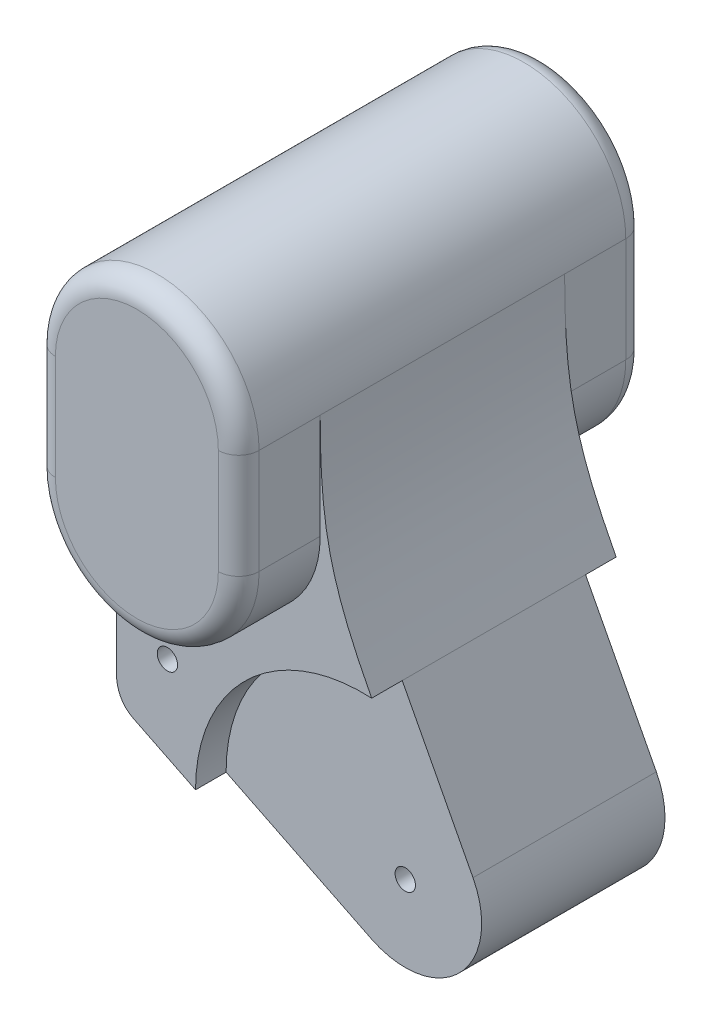
ISO-10303-21;
HEADER;
FILE_DESCRIPTION(('STEP AP214'),'2;1');
FILE_NAME('part.step','',(''),(''),'','','');
FILE_SCHEMA(('AUTOMOTIVE_DESIGN { 1 0 10303 214 1 1 1 1 }'));
ENDSEC;
DATA;
#1=APPLICATION_CONTEXT('core data for automotive mechanical design processes');
#2=APPLICATION_PROTOCOL_DEFINITION('international standard','automotive_design',2000,#1);
#3=PRODUCT_CONTEXT('',#1,'mechanical');
#4=PRODUCT('Part','Part','',(#3));
#5=PRODUCT_RELATED_PRODUCT_CATEGORY('part','',(#4));
#6=PRODUCT_DEFINITION_FORMATION('','',#4);
#7=PRODUCT_DEFINITION_CONTEXT('part definition',#1,'design');
#8=PRODUCT_DEFINITION('design','',#6,#7);
#9=PRODUCT_DEFINITION_SHAPE('','',#8);
#10=(LENGTH_UNIT() NAMED_UNIT(*) SI_UNIT(.MILLI.,.METRE.));
#11=(NAMED_UNIT(*) PLANE_ANGLE_UNIT() SI_UNIT($,.RADIAN.));
#12=(NAMED_UNIT(*) SI_UNIT($,.STERADIAN.) SOLID_ANGLE_UNIT());
#13=UNCERTAINTY_MEASURE_WITH_UNIT(LENGTH_MEASURE(1.E-05),#10,'distance_accuracy_value','');
#14=(GEOMETRIC_REPRESENTATION_CONTEXT(3) GLOBAL_UNCERTAINTY_ASSIGNED_CONTEXT((#13)) GLOBAL_UNIT_ASSIGNED_CONTEXT((#10,
#11,#12)) REPRESENTATION_CONTEXT('',''));
#15=CARTESIAN_POINT('',(0.,0.,0.));
#16=DIRECTION('',(0.,0.,1.));
#17=DIRECTION('',(1.,0.,0.));
#18=AXIS2_PLACEMENT_3D('',#15,#16,#17);
#19=CARTESIAN_POINT('',(10.4935176494257,10.3242980579361,0.));
#20=DIRECTION('',(0.,0.,-1.));
#21=DIRECTION('',(-1.,0.,0.));
#22=AXIS2_PLACEMENT_3D('',#19,#20,#21);
#23=PLANE('',#22);
#24=DIRECTION('',(0.,-1.,0.));
#25=VECTOR('',#24,1.);
#26=CARTESIAN_POINT('',(10.,10.3242980579361,0.));
#27=LINE('',#26,#25);
#28=CARTESIAN_POINT('',(10.,16.,0.));
#29=VERTEX_POINT('',#28);
#30=CARTESIAN_POINT('',(10.,10.8509069292975,0.));
#31=VERTEX_POINT('',#30);
#32=EDGE_CURVE('E208',#29,#31,#27,.T.);
#33=ORIENTED_EDGE('',*,*,#32,.F.);
#34=CARTESIAN_POINT('',(12.5270912932566,5.23059027215242,0.));
#35=CARTESIAN_POINT('',(10.4736833007163,9.15894696582903,0.));
#36=CARTESIAN_POINT('',(10.,11.2956510979498,0.));
#37=CARTESIAN_POINT('',(10.,16.,0.));
#38=B_SPLINE_CURVE_WITH_KNOTS('',3,(#34,#35,#36,#37),.UNSPECIFIED.,.F.,.F.,(4,4),(0.,1.),.UNSPECIFIED.);
#39=CARTESIAN_POINT('',(12.5270912932566,5.23059027215242,0.));
#40=VERTEX_POINT('',#39);
#41=EDGE_CURVE('E243',#40,#29,#38,.T.);
#42=ORIENTED_EDGE('',*,*,#41,.F.);
#43=CARTESIAN_POINT('',(12.1031617842985,-2.98102120584777,0.));
#44=DIRECTION('',(0.,0.,1.));
#45=DIRECTION('',(1.,0.,0.));
#46=AXIS2_PLACEMENT_3D('',#43,#44,#45);
#47=CIRCLE('',#46,8.22254700772151);
#48=CARTESIAN_POINT('',(3.8806186286962,-2.98898037969,0.));
#49=VERTEX_POINT('',#48);
#50=EDGE_CURVE('E211',#40,#49,#47,.T.);
#51=ORIENTED_EDGE('',*,*,#50,.T.);
#52=DIRECTION('',(0.896619982959267,-0.44280086512802,0.));
#53=VECTOR('',#52,1.);
#54=CARTESIAN_POINT('',(0.839496755769924,-1.48710509039849,0.));
#55=LINE('',#54,#53);
#56=CARTESIAN_POINT('',(0.839496755769925,-1.48710509039849,0.));
#57=VERTEX_POINT('',#56);
#58=EDGE_CURVE('E250',#57,#49,#55,.T.);
#59=ORIENTED_EDGE('',*,*,#58,.F.);
#60=CARTESIAN_POINT('',(0.,0.,0.));
#61=CARTESIAN_POINT('',(0.,-0.54020276968755,0.));
#62=CARTESIAN_POINT('',(0.191605084007119,-1.16714011279566,0.));
#63=CARTESIAN_POINT('',(0.839496755769925,-1.48710509039849,0.));
#64=B_SPLINE_CURVE_WITH_KNOTS('',3,(#60,#61,#62,#63),.UNSPECIFIED.,.F.,.F.,(4,4),(0.,1.),.UNSPECIFIED.);
#65=CARTESIAN_POINT('',(0.,0.,0.));
#66=VERTEX_POINT('',#65);
#67=EDGE_CURVE('E342',#66,#57,#64,.T.);
#68=ORIENTED_EDGE('',*,*,#67,.F.);
#69=DIRECTION('',(0.,-1.,0.));
#70=VECTOR('',#69,1.);
#71=CARTESIAN_POINT('',(0.,16.,0.));
#72=LINE('',#71,#70);
#73=CARTESIAN_POINT('',(0.,10.8509069292975,0.));
#74=VERTEX_POINT('',#73);
#75=EDGE_CURVE('E337',#74,#66,#72,.T.);
#76=ORIENTED_EDGE('',*,*,#75,.F.);
#77=CARTESIAN_POINT('',(5.,10.8509069292975,0.));
#78=DIRECTION('',(0.,0.,-1.));
#79=DIRECTION('',(-1.,0.,0.));
#80=AXIS2_PLACEMENT_3D('',#77,#78,#79);
#81=CIRCLE('',#80,5.);
#82=EDGE_CURVE('E188',#31,#74,#81,.T.);
#83=ORIENTED_EDGE('',*,*,#82,.F.);
#84=EDGE_LOOP('',(#33,#42,#51,#59,#68,#76,#83));
#85=FACE_BOUND('',#84,.T.);
#86=CARTESIAN_POINT('',(2.5,1.87521984569876,0.));
#87=DIRECTION('',(0.,0.,1.));
#88=DIRECTION('',(1.,0.,0.));
#89=AXIS2_PLACEMENT_3D('',#86,#87,#88);
#90=CIRCLE('',#89,0.500000000000002);
#91=CARTESIAN_POINT('',(3.,1.87521984569876,0.));
#92=VERTEX_POINT('',#91);
#93=EDGE_CURVE('E244',#92,#92,#90,.T.);
#94=ORIENTED_EDGE('',*,*,#93,.T.);
#95=EDGE_LOOP('',(#94));
#96=FACE_BOUND('',#95,.T.);
#97=ADVANCED_FACE('F34',(#85,#96),#23,.T.);
#98=CARTESIAN_POINT('',(0.839496755769924,-1.48710509039849,12.));
#99=DIRECTION('',(0.44280086512802,0.896619982959267,0.));
#100=DIRECTION('',(-0.896619982959267,0.44280086512802,0.));
#101=AXIS2_PLACEMENT_3D('',#98,#99,#100);
#102=PLANE('',#101);
#103=DIRECTION('',(0.,0.,-1.));
#104=VECTOR('',#103,1.);
#105=CARTESIAN_POINT('',(3.8806186286962,-2.98898037969,1.5));
#106=LINE('',#105,#104);
#107=CARTESIAN_POINT('',(3.8806186286962,-2.98898037969,1.5));
#108=VERTEX_POINT('',#107);
#109=EDGE_CURVE('E222',#108,#49,#106,.T.);
#110=ORIENTED_EDGE('',*,*,#109,.F.);
#111=DIRECTION('',(0.896619982959267,-0.44280086512802,0.));
#112=VECTOR('',#111,1.);
#113=CARTESIAN_POINT('',(3.8806186286962,-2.98898037969,1.5));
#114=LINE('',#113,#112);
#115=CARTESIAN_POINT('',(11.0161335623576,-6.51289490960152,1.5));
#116=VERTEX_POINT('',#115);
#117=EDGE_CURVE('E212',#108,#116,#114,.T.);
#118=ORIENTED_EDGE('',*,*,#117,.T.);
#119=DIRECTION('',(0.,0.,-1.));
#120=VECTOR('',#119,1.);
#121=CARTESIAN_POINT('',(11.0161335623576,-6.51289490960152,12.));
#122=LINE('',#121,#120);
#123=CARTESIAN_POINT('',(11.0161335623576,-6.51289490960152,10.5));
#124=VERTEX_POINT('',#123);
#125=EDGE_CURVE('E694',#124,#116,#122,.T.);
#126=ORIENTED_EDGE('',*,*,#125,.F.);
#127=DIRECTION('',(0.896619982959267,-0.44280086512802,0.));
#128=VECTOR('',#127,1.);
#129=CARTESIAN_POINT('',(3.8806186286962,-2.98898037969,10.5));
#130=LINE('',#129,#128);
#131=CARTESIAN_POINT('',(3.8806186286962,-2.98898037969,10.5));
#132=VERTEX_POINT('',#131);
#133=EDGE_CURVE('E229',#132,#124,#130,.T.);
#134=ORIENTED_EDGE('',*,*,#133,.F.);
#135=DIRECTION('',(0.,0.,1.));
#136=VECTOR('',#135,1.);
#137=CARTESIAN_POINT('',(3.8806186286962,-2.98898037969,10.5));
#138=LINE('',#137,#136);
#139=CARTESIAN_POINT('',(3.8806186286962,-2.98898037969,12.));
#140=VERTEX_POINT('',#139);
#141=EDGE_CURVE('E236',#132,#140,#138,.T.);
#142=ORIENTED_EDGE('',*,*,#141,.T.);
#143=DIRECTION('',(0.896619982959267,-0.44280086512802,0.));
#144=VECTOR('',#143,1.);
#145=CARTESIAN_POINT('',(0.839496755769924,-1.48710509039849,12.));
#146=LINE('',#145,#144);
#147=CARTESIAN_POINT('',(0.839496755769925,-1.48710509039849,12.));
#148=VERTEX_POINT('',#147);
#149=EDGE_CURVE('E326',#148,#140,#146,.T.);
#150=ORIENTED_EDGE('',*,*,#149,.F.);
#151=DIRECTION('',(0.,0.,-1.));
#152=VECTOR('',#151,1.);
#153=CARTESIAN_POINT('',(0.839496755769925,-1.48710509039849,12.));
#154=LINE('',#153,#152);
#155=EDGE_CURVE('E679',#148,#57,#154,.T.);
#156=ORIENTED_EDGE('',*,*,#155,.T.);
#157=ORIENTED_EDGE('',*,*,#58,.T.);
#158=EDGE_LOOP('',(#110,#118,#126,#134,#142,#150,#156,#157));
#159=FACE_BOUND('',#158,.T.);
#160=ADVANCED_FACE('F296',(#159),#102,.F.);
#161=CARTESIAN_POINT('',(12.6766368065877,-3.15056997350426,12.));
#162=DIRECTION('',(0.,0.,-1.));
#163=DIRECTION('',(-1.,0.,0.));
#164=AXIS2_PLACEMENT_3D('',#161,#162,#163);
#165=CYLINDRICAL_SURFACE('',#164,3.75);
#166=ORIENTED_EDGE('',*,*,#125,.T.);
#167=CARTESIAN_POINT('',(12.6766368065877,-3.15056997350426,1.5));
#168=DIRECTION('',(0.,0.,1.));
#169=DIRECTION('',(1.,0.,0.));
#170=AXIS2_PLACEMENT_3D('',#167,#168,#169);
#171=CIRCLE('',#170,3.75);
#172=CARTESIAN_POINT('',(16.,-1.41340070003888,1.5));
#173=VERTEX_POINT('',#172);
#174=EDGE_CURVE('E215',#116,#173,#171,.T.);
#175=ORIENTED_EDGE('',*,*,#174,.T.);
#176=DIRECTION('',(0.,0.,-1.));
#177=VECTOR('',#176,1.);
#178=CARTESIAN_POINT('',(16.,-1.41340070003888,12.));
#179=LINE('',#178,#177);
#180=CARTESIAN_POINT('',(16.,-1.41340070003888,10.5));
#181=VERTEX_POINT('',#180);
#182=EDGE_CURVE('E353',#181,#173,#179,.T.);
#183=ORIENTED_EDGE('',*,*,#182,.F.);
#184=CARTESIAN_POINT('',(12.6766368065877,-3.15056997350426,10.5));
#185=DIRECTION('',(0.,0.,1.));
#186=DIRECTION('',(1.,0.,0.));
#187=AXIS2_PLACEMENT_3D('',#184,#185,#186);
#188=CIRCLE('',#187,3.75);
#189=EDGE_CURVE('E231',#124,#181,#188,.T.);
#190=ORIENTED_EDGE('',*,*,#189,.F.);
#191=EDGE_LOOP('',(#166,#175,#183,#190));
#192=FACE_BOUND('',#191,.T.);
#193=ADVANCED_FACE('F302',(#192),#165,.T.);
#194=CARTESIAN_POINT('',(16.,-1.41340070003888,12.));
#195=DIRECTION('',(-0.886230184909952,-0.46324513959077,0.));
#196=DIRECTION('',(0.46324513959077,-0.886230184909952,0.));
#197=AXIS2_PLACEMENT_3D('',#194,#195,#196);
#198=PLANE('',#197);
#199=ORIENTED_EDGE('',*,*,#182,.T.);
#200=DIRECTION('',(-0.46324513959077,0.886230184909952,0.));
#201=VECTOR('',#200,1.);
#202=CARTESIAN_POINT('',(16.,-1.41340070003888,1.5));
#203=LINE('',#202,#201);
#204=CARTESIAN_POINT('',(12.5270912932566,5.23059027215242,1.5));
#205=VERTEX_POINT('',#204);
#206=EDGE_CURVE('E219',#173,#205,#203,.T.);
#207=ORIENTED_EDGE('',*,*,#206,.T.);
#208=DIRECTION('',(0.,0.,-1.));
#209=VECTOR('',#208,1.);
#210=CARTESIAN_POINT('',(12.5270912932566,5.23059027215242,12.));
#211=LINE('',#210,#209);
#212=CARTESIAN_POINT('',(12.5270912932566,5.23059027215242,10.5));
#213=VERTEX_POINT('',#212);
#214=EDGE_CURVE('E332',#213,#205,#211,.T.);
#215=ORIENTED_EDGE('',*,*,#214,.F.);
#216=DIRECTION('',(-0.46324513959077,0.886230184909952,0.));
#217=VECTOR('',#216,1.);
#218=CARTESIAN_POINT('',(16.,-1.41340070003888,10.5));
#219=LINE('',#218,#217);
#220=EDGE_CURVE('E234',#181,#213,#219,.T.);
#221=ORIENTED_EDGE('',*,*,#220,.F.);
#222=EDGE_LOOP('',(#199,#207,#215,#221));
#223=FACE_BOUND('',#222,.T.);
#224=ADVANCED_FACE('F310',(#223),#198,.F.);
#225=CARTESIAN_POINT('',(12.6766368065877,-3.15056997350426,12.));
#226=DIRECTION('',(0.,0.,-1.));
#227=DIRECTION('',(-1.,0.,0.));
#228=AXIS2_PLACEMENT_3D('',#225,#226,#227);
#229=CYLINDRICAL_SURFACE('',#228,0.500000000000001);
#230=CARTESIAN_POINT('',(12.6766368065877,-3.15056997350426,1.5));
#231=DIRECTION('',(0.,0.,1.));
#232=DIRECTION('',(1.,0.,0.));
#233=AXIS2_PLACEMENT_3D('',#230,#231,#232);
#234=CIRCLE('',#233,0.500000000000001);
#235=CARTESIAN_POINT('',(13.1766368065877,-3.15056997350426,1.5));
#236=VERTEX_POINT('',#235);
#237=EDGE_CURVE('E224',#236,#236,#234,.T.);
#238=ORIENTED_EDGE('',*,*,#237,.F.);
#239=EDGE_LOOP('',(#238));
#240=FACE_BOUND('',#239,.T.);
#241=CARTESIAN_POINT('',(12.6766368065877,-3.15056997350426,10.5));
#242=DIRECTION('',(0.,0.,1.));
#243=DIRECTION('',(1.,0.,0.));
#244=AXIS2_PLACEMENT_3D('',#241,#242,#243);
#245=CIRCLE('',#244,0.500000000000001);
#246=CARTESIAN_POINT('',(13.1766368065877,-3.15056997350426,10.5));
#247=VERTEX_POINT('',#246);
#248=EDGE_CURVE('E239',#247,#247,#245,.T.);
#249=ORIENTED_EDGE('',*,*,#248,.T.);
#250=EDGE_LOOP('',(#249));
#251=FACE_BOUND('',#250,.T.);
#252=ADVANCED_FACE('F313',(#240,#251),#229,.F.);
#253=CARTESIAN_POINT('',(10.4935176494257,10.3242980579361,12.));
#254=DIRECTION('',(0.,0.,-1.));
#255=DIRECTION('',(-1.,0.,0.));
#256=AXIS2_PLACEMENT_3D('',#253,#254,#255);
#257=PLANE('',#256);
#258=CARTESIAN_POINT('',(12.5270912932566,5.23059027215242,12.));
#259=CARTESIAN_POINT('',(10.4736833007163,9.15894696582903,12.));
#260=CARTESIAN_POINT('',(10.,11.2956510979498,12.));
#261=CARTESIAN_POINT('',(10.,16.,12.));
#262=B_SPLINE_CURVE_WITH_KNOTS('',3,(#258,#259,#260,#261),.UNSPECIFIED.,.F.,.F.,(4,4),(0.,1.),.UNSPECIFIED.);
#263=CARTESIAN_POINT('',(12.5270912932566,5.23059027215242,12.));
#264=VERTEX_POINT('',#263);
#265=CARTESIAN_POINT('',(10.,16.,12.));
#266=VERTEX_POINT('',#265);
#267=EDGE_CURVE('E179',#264,#266,#262,.T.);
#268=ORIENTED_EDGE('',*,*,#267,.T.);
#269=DIRECTION('',(0.,-1.,0.));
#270=VECTOR('',#269,1.);
#271=CARTESIAN_POINT('',(10.,10.3242980579361,12.));
#272=LINE('',#271,#270);
#273=CARTESIAN_POINT('',(10.,10.8509069292975,12.));
#274=VERTEX_POINT('',#273);
#275=EDGE_CURVE('E186',#266,#274,#272,.T.);
#276=ORIENTED_EDGE('',*,*,#275,.T.);
#277=CARTESIAN_POINT('',(5.,10.8509069292975,12.));
#278=DIRECTION('',(0.,0.,-1.));
#279=DIRECTION('',(-1.,0.,0.));
#280=AXIS2_PLACEMENT_3D('',#277,#278,#279);
#281=CIRCLE('',#280,5.);
#282=CARTESIAN_POINT('',(0.,10.8509069292975,12.));
#283=VERTEX_POINT('',#282);
#284=EDGE_CURVE('E182',#274,#283,#281,.T.);
#285=ORIENTED_EDGE('',*,*,#284,.T.);
#286=DIRECTION('',(0.,-1.,0.));
#287=VECTOR('',#286,1.);
#288=CARTESIAN_POINT('',(0.,16.,12.));
#289=LINE('',#288,#287);
#290=CARTESIAN_POINT('',(0.,0.,12.));
#291=VERTEX_POINT('',#290);
#292=EDGE_CURVE('E168',#283,#291,#289,.T.);
#293=ORIENTED_EDGE('',*,*,#292,.T.);
#294=CARTESIAN_POINT('',(0.,0.,12.));
#295=CARTESIAN_POINT('',(0.,-0.54020276968755,12.));
#296=CARTESIAN_POINT('',(0.191605084007119,-1.16714011279566,12.));
#297=CARTESIAN_POINT('',(0.839496755769925,-1.48710509039849,12.));
#298=B_SPLINE_CURVE_WITH_KNOTS('',3,(#294,#295,#296,#297),.UNSPECIFIED.,.F.,.F.,(4,4),(0.,1.),.UNSPECIFIED.);
#299=EDGE_CURVE('E178',#291,#148,#298,.T.);
#300=ORIENTED_EDGE('',*,*,#299,.T.);
#301=ORIENTED_EDGE('',*,*,#149,.T.);
#302=CARTESIAN_POINT('',(12.1031617842985,-2.98102120584777,12.));
#303=DIRECTION('',(0.,0.,1.));
#304=DIRECTION('',(1.,0.,0.));
#305=AXIS2_PLACEMENT_3D('',#302,#303,#304);
#306=CIRCLE('',#305,8.22254700772151);
#307=EDGE_CURVE('E228',#264,#140,#306,.T.);
#308=ORIENTED_EDGE('',*,*,#307,.F.);
#309=EDGE_LOOP('',(#268,#276,#285,#293,#300,#301,#308));
#310=FACE_BOUND('',#309,.T.);
#311=CARTESIAN_POINT('',(2.5,1.87521984569876,12.));
#312=DIRECTION('',(0.,0.,1.));
#313=DIRECTION('',(1.,0.,0.));
#314=AXIS2_PLACEMENT_3D('',#311,#312,#313);
#315=CIRCLE('',#314,0.500000000000002);
#316=CARTESIAN_POINT('',(3.,1.87521984569876,12.));
#317=VERTEX_POINT('',#316);
#318=EDGE_CURVE('E240',#317,#317,#315,.T.);
#319=ORIENTED_EDGE('',*,*,#318,.F.);
#320=EDGE_LOOP('',(#319));
#321=FACE_BOUND('',#320,.T.);
#322=ADVANCED_FACE('F183',(#310,#321),#257,.F.);
#323=DIRECTION('',(0.,0.,-1.));
#324=VECTOR('',#323,1.);
#325=SURFACE_OF_LINEAR_EXTRUSION('',#262,#324);
#326=ORIENTED_EDGE('',*,*,#41,.T.);
#327=DIRECTION('',(0.,0.,-1.));
#328=VECTOR('',#327,1.);
#329=CARTESIAN_POINT('',(10.,16.,12.));
#330=LINE('',#329,#328);
#331=EDGE_CURVE('E386',#266,#29,#330,.T.);
#332=ORIENTED_EDGE('',*,*,#331,.F.);
#333=ORIENTED_EDGE('',*,*,#267,.F.);
#334=EDGE_CURVE('E359',#264,#213,#211,.T.);
#335=ORIENTED_EDGE('',*,*,#334,.T.);
#336=ORIENTED_EDGE('',*,*,#214,.T.);
#337=DIRECTION('',(0.,0.,-1.));
#338=VECTOR('',#337,1.);
#339=CARTESIAN_POINT('',(12.5270912932566,5.23059027215242,1.5));
#340=LINE('',#339,#338);
#341=EDGE_CURVE('E225',#205,#40,#340,.T.);
#342=ORIENTED_EDGE('',*,*,#341,.T.);
#343=EDGE_LOOP('',(#326,#332,#333,#335,#336,#342));
#344=FACE_BOUND('',#343,.T.);
#345=ADVANCED_FACE('F256',(#344),#325,.F.);
#346=CARTESIAN_POINT('',(5.,16.,12.));
#347=DIRECTION('',(0.,0.,-1.));
#348=DIRECTION('',(-1.,0.,0.));
#349=AXIS2_PLACEMENT_3D('',#346,#347,#348);
#350=CYLINDRICAL_SURFACE('',#349,5.);
#351=DIRECTION('',(0.,0.,1.));
#352=VECTOR('',#351,1.);
#353=CARTESIAN_POINT('',(10.,16.,-4.));
#354=LINE('',#353,#352);
#355=CARTESIAN_POINT('',(10.,16.,-3.));
#356=VERTEX_POINT('',#355);
#357=EDGE_CURVE('E189',#356,#29,#354,.T.);
#358=ORIENTED_EDGE('',*,*,#357,.F.);
#359=CARTESIAN_POINT('',(5.,16.,-3.));
#360=DIRECTION('',(0.,0.,-1.));
#361=DIRECTION('',(-1.,0.,0.));
#362=AXIS2_PLACEMENT_3D('',#359,#360,#361);
#363=CIRCLE('',#362,5.);
#364=CARTESIAN_POINT('',(0.,16.,-3.));
#365=VERTEX_POINT('',#364);
#366=EDGE_CURVE('E397',#356,#365,#363,.F.);
#367=ORIENTED_EDGE('',*,*,#366,.T.);
#368=DIRECTION('',(0.,0.,-1.));
#369=VECTOR('',#368,1.);
#370=CARTESIAN_POINT('',(0.,16.,12.));
#371=LINE('',#370,#369);
#372=CARTESIAN_POINT('',(0.,16.,15.));
#373=VERTEX_POINT('',#372);
#374=EDGE_CURVE('E436',#373,#365,#371,.T.);
#375=ORIENTED_EDGE('',*,*,#374,.F.);
#376=CARTESIAN_POINT('',(5.,16.,15.));
#377=DIRECTION('',(0.,0.,-1.));
#378=DIRECTION('',(-1.,0.,0.));
#379=AXIS2_PLACEMENT_3D('',#376,#377,#378);
#380=CIRCLE('',#379,5.);
#381=CARTESIAN_POINT('',(10.,16.,15.));
#382=VERTEX_POINT('',#381);
#383=EDGE_CURVE('E395',#373,#382,#380,.T.);
#384=ORIENTED_EDGE('',*,*,#383,.T.);
#385=EDGE_CURVE('E435',#266,#382,#354,.T.);
#386=ORIENTED_EDGE('',*,*,#385,.F.);
#387=ORIENTED_EDGE('',*,*,#331,.T.);
#388=EDGE_LOOP('',(#358,#367,#375,#384,#386,#387));
#389=FACE_BOUND('',#388,.T.);
#390=ADVANCED_FACE('F260',(#389),#350,.T.);
#391=CARTESIAN_POINT('',(0.,16.,12.));
#392=DIRECTION('',(1.,0.,0.));
#393=DIRECTION('',(0.,1.,0.));
#394=AXIS2_PLACEMENT_3D('',#391,#392,#393);
#395=PLANE('',#394);
#396=ORIENTED_EDGE('',*,*,#374,.T.);
#397=DIRECTION('',(0.,-1.,0.));
#398=VECTOR('',#397,1.);
#399=CARTESIAN_POINT('',(0.,10.8509069292975,-3.));
#400=LINE('',#399,#398);
#401=CARTESIAN_POINT('',(0.,10.8509069292975,-3.));
#402=VERTEX_POINT('',#401);
#403=EDGE_CURVE('E401',#365,#402,#400,.T.);
#404=ORIENTED_EDGE('',*,*,#403,.T.);
#405=DIRECTION('',(0.,0.,1.));
#406=VECTOR('',#405,1.);
#407=CARTESIAN_POINT('',(0.,10.8509069292975,-4.));
#408=LINE('',#407,#406);
#409=EDGE_CURVE('E194',#402,#74,#408,.T.);
#410=ORIENTED_EDGE('',*,*,#409,.T.);
#411=ORIENTED_EDGE('',*,*,#75,.T.);
#412=DIRECTION('',(0.,0.,-1.));
#413=VECTOR('',#412,1.);
#414=CARTESIAN_POINT('',(0.,0.,12.));
#415=LINE('',#414,#413);
#416=EDGE_CURVE('E175',#291,#66,#415,.T.);
#417=ORIENTED_EDGE('',*,*,#416,.F.);
#418=ORIENTED_EDGE('',*,*,#292,.F.);
#419=CARTESIAN_POINT('',(0.,10.8509069292975,15.));
#420=VERTEX_POINT('',#419);
#421=EDGE_CURVE('E173',#283,#420,#408,.T.);
#422=ORIENTED_EDGE('',*,*,#421,.T.);
#423=DIRECTION('',(0.,-1.,0.));
#424=VECTOR('',#423,1.);
#425=CARTESIAN_POINT('',(0.,16.,15.));
#426=LINE('',#425,#424);
#427=EDGE_CURVE('E399',#420,#373,#426,.F.);
#428=ORIENTED_EDGE('',*,*,#427,.T.);
#429=EDGE_LOOP('',(#396,#404,#410,#411,#417,#418,#422,#428));
#430=FACE_BOUND('',#429,.T.);
#431=ADVANCED_FACE('F171',(#430),#395,.F.);
#432=DIRECTION('',(0.,0.,-1.));
#433=VECTOR('',#432,1.);
#434=SURFACE_OF_LINEAR_EXTRUSION('',#298,#433);
#435=ORIENTED_EDGE('',*,*,#67,.T.);
#436=ORIENTED_EDGE('',*,*,#155,.F.);
#437=ORIENTED_EDGE('',*,*,#299,.F.);
#438=ORIENTED_EDGE('',*,*,#416,.T.);
#439=EDGE_LOOP('',(#435,#436,#437,#438));
#440=FACE_BOUND('',#439,.T.);
#441=ADVANCED_FACE('F318',(#440),#434,.F.);
#442=CARTESIAN_POINT('',(2.5,1.87521984569876,12.));
#443=DIRECTION('',(0.,0.,-1.));
#444=DIRECTION('',(-1.,0.,0.));
#445=AXIS2_PLACEMENT_3D('',#442,#443,#444);
#446=CYLINDRICAL_SURFACE('',#445,0.500000000000002);
#447=ORIENTED_EDGE('',*,*,#318,.T.);
#448=EDGE_LOOP('',(#447));
#449=FACE_BOUND('',#448,.T.);
#450=ORIENTED_EDGE('',*,*,#93,.F.);
#451=EDGE_LOOP('',(#450));
#452=FACE_BOUND('',#451,.T.);
#453=ADVANCED_FACE('F320',(#449,#452),#446,.F.);
#454=CARTESIAN_POINT('',(12.1031617842985,-2.98102120584777,10.5));
#455=DIRECTION('',(0.,0.,1.));
#456=DIRECTION('',(1.,0.,0.));
#457=AXIS2_PLACEMENT_3D('',#454,#455,#456);
#458=CYLINDRICAL_SURFACE('',#457,8.22254700772151);
#459=ORIENTED_EDGE('',*,*,#307,.T.);
#460=ORIENTED_EDGE('',*,*,#141,.F.);
#461=CARTESIAN_POINT('',(12.1031617842985,-2.98102120584777,10.5));
#462=DIRECTION('',(0.,0.,1.));
#463=DIRECTION('',(1.,0.,0.));
#464=AXIS2_PLACEMENT_3D('',#461,#462,#463);
#465=CIRCLE('',#464,8.22254700772151);
#466=EDGE_CURVE('E232',#213,#132,#465,.T.);
#467=ORIENTED_EDGE('',*,*,#466,.F.);
#468=ORIENTED_EDGE('',*,*,#334,.F.);
#469=EDGE_LOOP('',(#459,#460,#467,#468));
#470=FACE_BOUND('',#469,.T.);
#471=ADVANCED_FACE('F468',(#470),#458,.F.);
#472=CARTESIAN_POINT('',(12.1031617842985,-2.98102120584777,10.5));
#473=DIRECTION('',(0.,0.,1.));
#474=DIRECTION('',(1.,0.,0.));
#475=AXIS2_PLACEMENT_3D('',#472,#473,#474);
#476=PLANE('',#475);
#477=ORIENTED_EDGE('',*,*,#248,.F.);
#478=EDGE_LOOP('',(#477));
#479=FACE_BOUND('',#478,.T.);
#480=ORIENTED_EDGE('',*,*,#466,.T.);
#481=ORIENTED_EDGE('',*,*,#133,.T.);
#482=ORIENTED_EDGE('',*,*,#189,.T.);
#483=ORIENTED_EDGE('',*,*,#220,.T.);
#484=EDGE_LOOP('',(#480,#481,#482,#483));
#485=FACE_BOUND('',#484,.T.);
#486=ADVANCED_FACE('F464',(#479,#485),#476,.T.);
#487=CARTESIAN_POINT('',(12.1031617842985,-2.98102120584777,1.5));
#488=DIRECTION('',(0.,0.,-1.));
#489=DIRECTION('',(-1.,0.,0.));
#490=AXIS2_PLACEMENT_3D('',#487,#488,#489);
#491=CYLINDRICAL_SURFACE('',#490,8.22254700772151);
#492=ORIENTED_EDGE('',*,*,#50,.F.);
#493=ORIENTED_EDGE('',*,*,#341,.F.);
#494=CARTESIAN_POINT('',(12.1031617842985,-2.98102120584777,1.5));
#495=DIRECTION('',(0.,0.,1.));
#496=DIRECTION('',(1.,0.,0.));
#497=AXIS2_PLACEMENT_3D('',#494,#495,#496);
#498=CIRCLE('',#497,8.22254700772151);
#499=EDGE_CURVE('E216',#205,#108,#498,.T.);
#500=ORIENTED_EDGE('',*,*,#499,.T.);
#501=ORIENTED_EDGE('',*,*,#109,.T.);
#502=EDGE_LOOP('',(#492,#493,#500,#501));
#503=FACE_BOUND('',#502,.T.);
#504=ADVANCED_FACE('F452',(#503),#491,.F.);
#505=CARTESIAN_POINT('',(12.1031617842985,-2.98102120584777,1.5));
#506=DIRECTION('',(0.,0.,1.));
#507=DIRECTION('',(1.,0.,0.));
#508=AXIS2_PLACEMENT_3D('',#505,#506,#507);
#509=PLANE('',#508);
#510=ORIENTED_EDGE('',*,*,#237,.T.);
#511=EDGE_LOOP('',(#510));
#512=FACE_BOUND('',#511,.T.);
#513=ORIENTED_EDGE('',*,*,#499,.F.);
#514=ORIENTED_EDGE('',*,*,#206,.F.);
#515=ORIENTED_EDGE('',*,*,#174,.F.);
#516=ORIENTED_EDGE('',*,*,#117,.F.);
#517=EDGE_LOOP('',(#513,#514,#515,#516));
#518=FACE_BOUND('',#517,.T.);
#519=ADVANCED_FACE('F444',(#512,#518),#509,.F.);
#520=CARTESIAN_POINT('',(5.,16.,16.));
#521=DIRECTION('',(0.,0.,-1.));
#522=DIRECTION('',(-1.,0.,0.));
#523=AXIS2_PLACEMENT_3D('',#520,#521,#522);
#524=PLANE('',#523);
#525=DIRECTION('',(0.,-1.,0.));
#526=VECTOR('',#525,1.);
#527=CARTESIAN_POINT('',(1.,16.,16.));
#528=LINE('',#527,#526);
#529=CARTESIAN_POINT('',(1.,16.,16.));
#530=VERTEX_POINT('',#529);
#531=CARTESIAN_POINT('',(1.,10.8509069292975,16.));
#532=VERTEX_POINT('',#531);
#533=EDGE_CURVE('E57',#530,#532,#528,.T.);
#534=ORIENTED_EDGE('',*,*,#533,.T.);
#535=CARTESIAN_POINT('',(5.,10.8509069292975,16.));
#536=DIRECTION('',(0.,0.,-1.));
#537=DIRECTION('',(-1.,0.,0.));
#538=AXIS2_PLACEMENT_3D('',#535,#536,#537);
#539=CIRCLE('',#538,4.);
#540=CARTESIAN_POINT('',(9.,10.8509069292975,16.));
#541=VERTEX_POINT('',#540);
#542=EDGE_CURVE('E410',#532,#541,#539,.F.);
#543=ORIENTED_EDGE('',*,*,#542,.T.);
#544=DIRECTION('',(0.,1.,0.));
#545=VECTOR('',#544,1.);
#546=CARTESIAN_POINT('',(9.,16.,16.));
#547=LINE('',#546,#545);
#548=CARTESIAN_POINT('',(9.,16.,16.));
#549=VERTEX_POINT('',#548);
#550=EDGE_CURVE('E405',#541,#549,#547,.T.);
#551=ORIENTED_EDGE('',*,*,#550,.T.);
#552=CARTESIAN_POINT('',(5.,16.,16.));
#553=DIRECTION('',(0.,0.,-1.));
#554=DIRECTION('',(-1.,0.,0.));
#555=AXIS2_PLACEMENT_3D('',#552,#553,#554);
#556=CIRCLE('',#555,4.);
#557=EDGE_CURVE('E407',#549,#530,#556,.F.);
#558=ORIENTED_EDGE('',*,*,#557,.T.);
#559=EDGE_LOOP('',(#534,#543,#551,#558));
#560=FACE_BOUND('',#559,.T.);
#561=ADVANCED_FACE('F442',(#560),#524,.F.);
#562=CARTESIAN_POINT('',(5.,10.8509069292975,-4.));
#563=DIRECTION('',(0.,0.,1.));
#564=DIRECTION('',(1.,0.,0.));
#565=AXIS2_PLACEMENT_3D('',#562,#563,#564);
#566=CYLINDRICAL_SURFACE('',#565,5.);
#567=DIRECTION('',(0.,0.,1.));
#568=VECTOR('',#567,1.);
#569=CARTESIAN_POINT('',(10.,10.8509069292975,-4.));
#570=LINE('',#569,#568);
#571=CARTESIAN_POINT('',(10.,10.8509069292975,15.));
#572=VERTEX_POINT('',#571);
#573=EDGE_CURVE('E197',#274,#572,#570,.T.);
#574=ORIENTED_EDGE('',*,*,#573,.T.);
#575=CARTESIAN_POINT('',(5.,10.8509069292975,15.));
#576=DIRECTION('',(0.,0.,-1.));
#577=DIRECTION('',(-1.,0.,0.));
#578=AXIS2_PLACEMENT_3D('',#575,#576,#577);
#579=CIRCLE('',#578,5.);
#580=EDGE_CURVE('E43',#572,#420,#579,.T.);
#581=ORIENTED_EDGE('',*,*,#580,.T.);
#582=ORIENTED_EDGE('',*,*,#421,.F.);
#583=ORIENTED_EDGE('',*,*,#284,.F.);
#584=EDGE_LOOP('',(#574,#581,#582,#583));
#585=FACE_BOUND('',#584,.T.);
#586=ADVANCED_FACE('F192',(#585),#566,.T.);
#587=CARTESIAN_POINT('',(10.,10.8509069292975,-4.));
#588=DIRECTION('',(1.,0.,0.));
#589=DIRECTION('',(0.,0.,-1.));
#590=AXIS2_PLACEMENT_3D('',#587,#588,#589);
#591=PLANE('',#590);
#592=ORIENTED_EDGE('',*,*,#385,.T.);
#593=DIRECTION('',(0.,1.,0.));
#594=VECTOR('',#593,1.);
#595=CARTESIAN_POINT('',(10.,10.8509069292975,15.));
#596=LINE('',#595,#594);
#597=EDGE_CURVE('E11',#382,#572,#596,.F.);
#598=ORIENTED_EDGE('',*,*,#597,.T.);
#599=ORIENTED_EDGE('',*,*,#573,.F.);
#600=ORIENTED_EDGE('',*,*,#275,.F.);
#601=EDGE_LOOP('',(#592,#598,#599,#600));
#602=FACE_BOUND('',#601,.T.);
#603=ADVANCED_FACE('F437',(#602),#591,.T.);
#604=CARTESIAN_POINT('',(10.,10.8509069292975,-3.));
#605=VERTEX_POINT('',#604);
#606=EDGE_CURVE('E202',#605,#31,#570,.T.);
#607=ORIENTED_EDGE('',*,*,#606,.F.);
#608=DIRECTION('',(0.,1.,0.));
#609=VECTOR('',#608,1.);
#610=CARTESIAN_POINT('',(10.,10.8509069292975,-3.));
#611=LINE('',#610,#609);
#612=EDGE_CURVE('E382',#605,#356,#611,.T.);
#613=ORIENTED_EDGE('',*,*,#612,.T.);
#614=ORIENTED_EDGE('',*,*,#357,.T.);
#615=ORIENTED_EDGE('',*,*,#32,.T.);
#616=EDGE_LOOP('',(#607,#613,#614,#615));
#617=FACE_BOUND('',#616,.T.);
#618=ADVANCED_FACE('F457',(#617),#591,.T.);
#619=ORIENTED_EDGE('',*,*,#409,.F.);
#620=CARTESIAN_POINT('',(5.,10.8509069292975,-3.));
#621=DIRECTION('',(0.,0.,-1.));
#622=DIRECTION('',(-1.,0.,0.));
#623=AXIS2_PLACEMENT_3D('',#620,#621,#622);
#624=CIRCLE('',#623,5.);
#625=EDGE_CURVE('E403',#402,#605,#624,.F.);
#626=ORIENTED_EDGE('',*,*,#625,.T.);
#627=ORIENTED_EDGE('',*,*,#606,.T.);
#628=ORIENTED_EDGE('',*,*,#82,.T.);
#629=EDGE_LOOP('',(#619,#626,#627,#628));
#630=FACE_BOUND('',#629,.T.);
#631=ADVANCED_FACE('F451',(#630),#566,.T.);
#632=CARTESIAN_POINT('',(5.,16.,-4.));
#633=DIRECTION('',(0.,0.,-1.));
#634=DIRECTION('',(-1.,0.,0.));
#635=AXIS2_PLACEMENT_3D('',#632,#633,#634);
#636=PLANE('',#635);
#637=CARTESIAN_POINT('',(5.,16.,-4.));
#638=DIRECTION('',(0.,0.,-1.));
#639=DIRECTION('',(-1.,0.,0.));
#640=AXIS2_PLACEMENT_3D('',#637,#638,#639);
#641=CIRCLE('',#640,4.);
#642=CARTESIAN_POINT('',(1.,16.,-4.));
#643=VERTEX_POINT('',#642);
#644=CARTESIAN_POINT('',(9.,16.,-4.));
#645=VERTEX_POINT('',#644);
#646=EDGE_CURVE('E390',#643,#645,#641,.T.);
#647=ORIENTED_EDGE('',*,*,#646,.T.);
#648=DIRECTION('',(0.,1.,0.));
#649=VECTOR('',#648,1.);
#650=CARTESIAN_POINT('',(9.,16.,-4.));
#651=LINE('',#650,#649);
#652=CARTESIAN_POINT('',(9.,10.8509069292975,-4.));
#653=VERTEX_POINT('',#652);
#654=EDGE_CURVE('E392',#645,#653,#651,.F.);
#655=ORIENTED_EDGE('',*,*,#654,.T.);
#656=CARTESIAN_POINT('',(5.,10.8509069292975,-4.));
#657=DIRECTION('',(0.,0.,-1.));
#658=DIRECTION('',(-1.,0.,0.));
#659=AXIS2_PLACEMENT_3D('',#656,#657,#658);
#660=CIRCLE('',#659,4.);
#661=CARTESIAN_POINT('',(1.,10.8509069292975,-4.));
#662=VERTEX_POINT('',#661);
#663=EDGE_CURVE('E385',#653,#662,#660,.T.);
#664=ORIENTED_EDGE('',*,*,#663,.T.);
#665=DIRECTION('',(0.,-1.,0.));
#666=VECTOR('',#665,1.);
#667=CARTESIAN_POINT('',(1.,16.,-4.));
#668=LINE('',#667,#666);
#669=EDGE_CURVE('E388',#662,#643,#668,.F.);
#670=ORIENTED_EDGE('',*,*,#669,.T.);
#671=EDGE_LOOP('',(#647,#655,#664,#670));
#672=FACE_BOUND('',#671,.T.);
#673=ADVANCED_FACE('F278',(#672),#636,.T.);
#674=CARTESIAN_POINT('',(1.,16.,-3.));
#675=DIRECTION('',(0.,1.,0.));
#676=DIRECTION('',(-1.,0.,0.));
#677=AXIS2_PLACEMENT_3D('',#674,#675,#676);
#678=CYLINDRICAL_SURFACE('',#677,1.);
#679=CARTESIAN_POINT('',(1.,16.,-3.));
#680=DIRECTION('',(0.,1.,0.));
#681=DIRECTION('',(0.,0.,1.));
#682=AXIS2_PLACEMENT_3D('',#679,#680,#681);
#683=CIRCLE('',#682,1.);
#684=EDGE_CURVE('E199',#643,#365,#683,.T.);
#685=ORIENTED_EDGE('',*,*,#684,.F.);
#686=ORIENTED_EDGE('',*,*,#669,.F.);
#687=CARTESIAN_POINT('',(1.,10.8509069292975,-3.));
#688=DIRECTION('',(0.,-1.,0.));
#689=DIRECTION('',(0.,0.,-1.));
#690=AXIS2_PLACEMENT_3D('',#687,#688,#689);
#691=CIRCLE('',#690,1.);
#692=EDGE_CURVE('E195',#402,#662,#691,.T.);
#693=ORIENTED_EDGE('',*,*,#692,.F.);
#694=ORIENTED_EDGE('',*,*,#403,.F.);
#695=EDGE_LOOP('',(#685,#686,#693,#694));
#696=FACE_BOUND('',#695,.T.);
#697=ADVANCED_FACE('F274',(#696),#678,.T.);
#698=CARTESIAN_POINT('',(5.,10.8509069292975,-3.));
#699=DIRECTION('',(0.,0.,-1.));
#700=DIRECTION('',(-1.,0.,0.));
#701=AXIS2_PLACEMENT_3D('',#698,#699,#700);
#702=TOROIDAL_SURFACE('',#701,4.,1.);
#703=ORIENTED_EDGE('',*,*,#692,.T.);
#704=ORIENTED_EDGE('',*,*,#663,.F.);
#705=CARTESIAN_POINT('',(9.,10.8509069292975,-3.));
#706=DIRECTION('',(0.,1.,0.));
#707=DIRECTION('',(0.,0.,1.));
#708=AXIS2_PLACEMENT_3D('',#705,#706,#707);
#709=CIRCLE('',#708,1.);
#710=EDGE_CURVE('E415',#605,#653,#709,.T.);
#711=ORIENTED_EDGE('',*,*,#710,.F.);
#712=ORIENTED_EDGE('',*,*,#625,.F.);
#713=EDGE_LOOP('',(#703,#704,#711,#712));
#714=FACE_BOUND('',#713,.T.);
#715=ADVANCED_FACE('F270',(#714),#702,.T.);
#716=CARTESIAN_POINT('',(5.,16.,-3.));
#717=DIRECTION('',(0.,0.,-1.));
#718=DIRECTION('',(-1.,0.,0.));
#719=AXIS2_PLACEMENT_3D('',#716,#717,#718);
#720=TOROIDAL_SURFACE('',#719,4.,1.);
#721=ORIENTED_EDGE('',*,*,#684,.T.);
#722=ORIENTED_EDGE('',*,*,#366,.F.);
#723=CARTESIAN_POINT('',(9.,16.,-3.));
#724=DIRECTION('',(0.,-1.,0.));
#725=DIRECTION('',(0.,0.,-1.));
#726=AXIS2_PLACEMENT_3D('',#723,#724,#725);
#727=CIRCLE('',#726,1.);
#728=EDGE_CURVE('E413',#645,#356,#727,.T.);
#729=ORIENTED_EDGE('',*,*,#728,.F.);
#730=ORIENTED_EDGE('',*,*,#646,.F.);
#731=EDGE_LOOP('',(#721,#722,#729,#730));
#732=FACE_BOUND('',#731,.T.);
#733=ADVANCED_FACE('F266',(#732),#720,.T.);
#734=CARTESIAN_POINT('',(9.,10.8509069292975,-3.));
#735=DIRECTION('',(0.,1.,0.));
#736=DIRECTION('',(0.,0.,1.));
#737=AXIS2_PLACEMENT_3D('',#734,#735,#736);
#738=CYLINDRICAL_SURFACE('',#737,1.);
#739=ORIENTED_EDGE('',*,*,#710,.T.);
#740=ORIENTED_EDGE('',*,*,#654,.F.);
#741=ORIENTED_EDGE('',*,*,#728,.T.);
#742=ORIENTED_EDGE('',*,*,#612,.F.);
#743=EDGE_LOOP('',(#739,#740,#741,#742));
#744=FACE_BOUND('',#743,.T.);
#745=ADVANCED_FACE('F263',(#744),#738,.T.);
#746=CARTESIAN_POINT('',(5.,16.,15.));
#747=DIRECTION('',(0.,0.,-1.));
#748=DIRECTION('',(-1.,0.,0.));
#749=AXIS2_PLACEMENT_3D('',#746,#747,#748);
#750=TOROIDAL_SURFACE('',#749,4.,1.);
#751=CARTESIAN_POINT('',(9.,16.,15.));
#752=DIRECTION('',(0.,-1.,0.));
#753=DIRECTION('',(0.,0.,-1.));
#754=AXIS2_PLACEMENT_3D('',#751,#752,#753);
#755=CIRCLE('',#754,1.);
#756=EDGE_CURVE('E422',#382,#549,#755,.T.);
#757=ORIENTED_EDGE('',*,*,#756,.F.);
#758=ORIENTED_EDGE('',*,*,#383,.F.);
#759=CARTESIAN_POINT('',(1.,16.,15.));
#760=DIRECTION('',(0.,-1.,0.));
#761=DIRECTION('',(0.,0.,-1.));
#762=AXIS2_PLACEMENT_3D('',#759,#760,#761);
#763=CIRCLE('',#762,1.);
#764=EDGE_CURVE('E38',#530,#373,#763,.T.);
#765=ORIENTED_EDGE('',*,*,#764,.F.);
#766=ORIENTED_EDGE('',*,*,#557,.F.);
#767=EDGE_LOOP('',(#757,#758,#765,#766));
#768=FACE_BOUND('',#767,.T.);
#769=ADVANCED_FACE('F36',(#768),#750,.T.);
#770=CARTESIAN_POINT('',(1.,16.,15.));
#771=DIRECTION('',(0.,-1.,0.));
#772=DIRECTION('',(1.,0.,0.));
#773=AXIS2_PLACEMENT_3D('',#770,#771,#772);
#774=CYLINDRICAL_SURFACE('',#773,1.);
#775=ORIENTED_EDGE('',*,*,#764,.T.);
#776=ORIENTED_EDGE('',*,*,#427,.F.);
#777=CARTESIAN_POINT('',(1.,10.8509069292975,15.));
#778=DIRECTION('',(0.,-1.,0.));
#779=DIRECTION('',(1.,0.,0.));
#780=AXIS2_PLACEMENT_3D('',#777,#778,#779);
#781=CIRCLE('',#780,1.);
#782=EDGE_CURVE('E421',#532,#420,#781,.T.);
#783=ORIENTED_EDGE('',*,*,#782,.F.);
#784=ORIENTED_EDGE('',*,*,#533,.F.);
#785=EDGE_LOOP('',(#775,#776,#783,#784));
#786=FACE_BOUND('',#785,.T.);
#787=ADVANCED_FACE('F286',(#786),#774,.T.);
#788=CARTESIAN_POINT('',(9.,16.,15.));
#789=DIRECTION('',(0.,-1.,0.));
#790=DIRECTION('',(0.,0.,-1.));
#791=AXIS2_PLACEMENT_3D('',#788,#789,#790);
#792=CYLINDRICAL_SURFACE('',#791,1.);
#793=ORIENTED_EDGE('',*,*,#756,.T.);
#794=ORIENTED_EDGE('',*,*,#550,.F.);
#795=CARTESIAN_POINT('',(9.,10.8509069292975,15.));
#796=DIRECTION('',(0.,-1.,0.));
#797=DIRECTION('',(0.,0.,-1.));
#798=AXIS2_PLACEMENT_3D('',#795,#796,#797);
#799=CIRCLE('',#798,1.);
#800=EDGE_CURVE('E419',#572,#541,#799,.T.);
#801=ORIENTED_EDGE('',*,*,#800,.F.);
#802=ORIENTED_EDGE('',*,*,#597,.F.);
#803=EDGE_LOOP('',(#793,#794,#801,#802));
#804=FACE_BOUND('',#803,.T.);
#805=ADVANCED_FACE('F283',(#804),#792,.T.);
#806=CARTESIAN_POINT('',(5.,10.8509069292975,15.));
#807=DIRECTION('',(0.,0.,-1.));
#808=DIRECTION('',(-1.,0.,0.));
#809=AXIS2_PLACEMENT_3D('',#806,#807,#808);
#810=TOROIDAL_SURFACE('',#809,4.,1.);
#811=ORIENTED_EDGE('',*,*,#782,.T.);
#812=ORIENTED_EDGE('',*,*,#580,.F.);
#813=ORIENTED_EDGE('',*,*,#800,.T.);
#814=ORIENTED_EDGE('',*,*,#542,.F.);
#815=EDGE_LOOP('',(#811,#812,#813,#814));
#816=FACE_BOUND('',#815,.T.);
#817=ADVANCED_FACE('F280',(#816),#810,.T.);
#818=CLOSED_SHELL('',(#97,#160,#193,#224,#252,#322,#345,#390,#431,#441,#453,#471,#486,#504,#519,
#561,#586,#603,#618,#631,#673,#697,#715,#733,#745,#769,#787,#805,#817));
#819=MANIFOLD_SOLID_BREP('B2',#818);
#820=ADVANCED_BREP_SHAPE_REPRESENTATION('',(#18,#819),#14);
#821=SHAPE_DEFINITION_REPRESENTATION(#9,#820);
ENDSEC;
END-ISO-10303-21;
